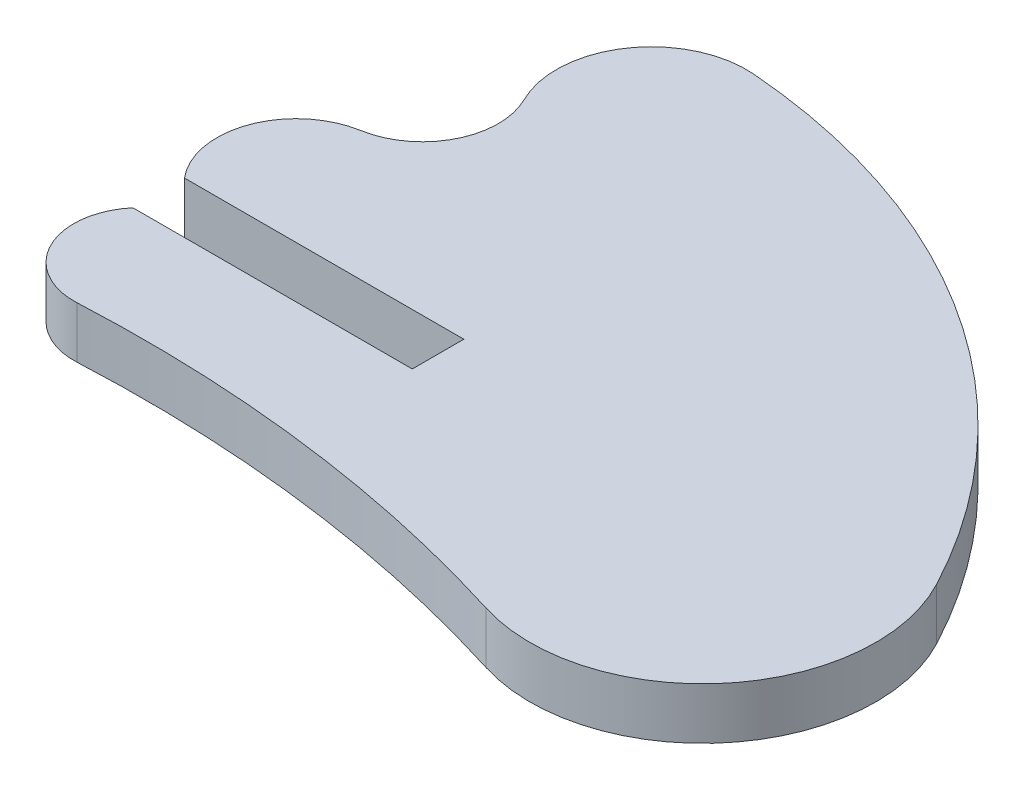
ISO-10303-21;
HEADER;
FILE_DESCRIPTION(('STEP AP214'),'2;1');
FILE_NAME('part.step','',(''),(''),'','','');
FILE_SCHEMA(('AUTOMOTIVE_DESIGN { 1 0 10303 214 1 1 1 1 }'));
ENDSEC;
DATA;
#1=APPLICATION_CONTEXT('core data for automotive mechanical design processes');
#2=APPLICATION_PROTOCOL_DEFINITION('international standard','automotive_design',2000,#1);
#3=PRODUCT_CONTEXT('',#1,'mechanical');
#4=PRODUCT('Part','Part','',(#3));
#5=PRODUCT_RELATED_PRODUCT_CATEGORY('part','',(#4));
#6=PRODUCT_DEFINITION_FORMATION('','',#4);
#7=PRODUCT_DEFINITION_CONTEXT('part definition',#1,'design');
#8=PRODUCT_DEFINITION('design','',#6,#7);
#9=PRODUCT_DEFINITION_SHAPE('','',#8);
#10=(LENGTH_UNIT() NAMED_UNIT(*) SI_UNIT(.MILLI.,.METRE.));
#11=(NAMED_UNIT(*) PLANE_ANGLE_UNIT() SI_UNIT($,.RADIAN.));
#12=(NAMED_UNIT(*) SI_UNIT($,.STERADIAN.) SOLID_ANGLE_UNIT());
#13=UNCERTAINTY_MEASURE_WITH_UNIT(LENGTH_MEASURE(1.E-05),#10,'distance_accuracy_value','');
#14=(GEOMETRIC_REPRESENTATION_CONTEXT(3) GLOBAL_UNCERTAINTY_ASSIGNED_CONTEXT((#13)) GLOBAL_UNIT_ASSIGNED_CONTEXT((#10,
#11,#12)) REPRESENTATION_CONTEXT('',''));
#15=CARTESIAN_POINT('',(0.,0.,0.));
#16=DIRECTION('',(0.,0.,1.));
#17=DIRECTION('',(1.,0.,0.));
#18=AXIS2_PLACEMENT_3D('',#15,#16,#17);
#19=CARTESIAN_POINT('',(-41817.0317918192,3.,-18208.9563791856));
#20=DIRECTION('',(0.,-1.,0.));
#21=DIRECTION('',(0.,0.,-1.));
#22=AXIS2_PLACEMENT_3D('',#19,#20,#21);
#23=CYLINDRICAL_SURFACE('',#22,10.0652598486996);
#24=CARTESIAN_POINT('',(-41817.0317918192,0.,-18208.9563791856));
#25=DIRECTION('',(0.,1.,0.));
#26=DIRECTION('',(0.,0.,1.));
#27=AXIS2_PLACEMENT_3D('',#24,#25,#26);
#28=CIRCLE('',#27,10.0652598486996);
#29=CARTESIAN_POINT('',(-41820.040166,0.,-18199.3512170001));
#30=VERTEX_POINT('',#29);
#31=CARTESIAN_POINT('',(-41808.137642,0.,-18213.668444));
#32=VERTEX_POINT('',#31);
#33=EDGE_CURVE('E143',#30,#32,#28,.T.);
#34=ORIENTED_EDGE('',*,*,#33,.T.);
#35=DIRECTION('',(0.,-1.,0.));
#36=VECTOR('',#35,1.);
#37=CARTESIAN_POINT('',(-41808.137642,3.,-18213.668444));
#38=LINE('',#37,#36);
#39=CARTESIAN_POINT('',(-41808.137642,3.,-18213.668444));
#40=VERTEX_POINT('',#39);
#41=EDGE_CURVE('E11',#40,#32,#38,.T.);
#42=ORIENTED_EDGE('',*,*,#41,.F.);
#43=CARTESIAN_POINT('',(-41817.0317918192,3.,-18208.9563791856));
#44=DIRECTION('',(0.,1.,0.));
#45=DIRECTION('',(0.,0.,1.));
#46=AXIS2_PLACEMENT_3D('',#43,#44,#45);
#47=CIRCLE('',#46,10.0652598486996);
#48=CARTESIAN_POINT('',(-41820.040166,3.,-18199.3512170001));
#49=VERTEX_POINT('',#48);
#50=EDGE_CURVE('E161',#49,#40,#47,.T.);
#51=ORIENTED_EDGE('',*,*,#50,.F.);
#52=DIRECTION('',(0.,-1.,0.));
#53=VECTOR('',#52,1.);
#54=CARTESIAN_POINT('',(-41820.040166,3.,-18199.3512170001));
#55=LINE('',#54,#53);
#56=EDGE_CURVE('E139',#49,#30,#55,.T.);
#57=ORIENTED_EDGE('',*,*,#56,.T.);
#58=EDGE_LOOP('',(#34,#42,#51,#57));
#59=FACE_BOUND('',#58,.T.);
#60=ADVANCED_FACE('F35',(#59),#23,.T.);
#61=CARTESIAN_POINT('',(-41842.1884395668,3.,-18195.6353827592));
#62=DIRECTION('',(0.,-1.,0.));
#63=DIRECTION('',(0.,0.,-1.));
#64=AXIS2_PLACEMENT_3D('',#61,#62,#63);
#65=CYLINDRICAL_SURFACE('',#64,38.5311317332988);
#66=CARTESIAN_POINT('',(-41842.1884395668,0.,-18195.6353827592));
#67=DIRECTION('',(0.,1.,0.));
#68=DIRECTION('',(0.,0.,1.));
#69=AXIS2_PLACEMENT_3D('',#66,#67,#68);
#70=CIRCLE('',#69,38.5311317332988);
#71=CARTESIAN_POINT('',(-41839.185761,0.,-18234.0493390001));
#72=VERTEX_POINT('',#71);
#73=EDGE_CURVE('E146',#32,#72,#70,.T.);
#74=ORIENTED_EDGE('',*,*,#73,.T.);
#75=DIRECTION('',(0.,-1.,0.));
#76=VECTOR('',#75,1.);
#77=CARTESIAN_POINT('',(-41839.185761,3.,-18234.0493390001));
#78=LINE('',#77,#76);
#79=CARTESIAN_POINT('',(-41839.185761,3.,-18234.0493390001));
#80=VERTEX_POINT('',#79);
#81=EDGE_CURVE('E43',#80,#72,#78,.T.);
#82=ORIENTED_EDGE('',*,*,#81,.F.);
#83=CARTESIAN_POINT('',(-41842.1884395668,3.,-18195.6353827592));
#84=DIRECTION('',(0.,1.,0.));
#85=DIRECTION('',(0.,0.,1.));
#86=AXIS2_PLACEMENT_3D('',#83,#84,#85);
#87=CIRCLE('',#86,38.5311317332988);
#88=EDGE_CURVE('E100',#40,#80,#87,.T.);
#89=ORIENTED_EDGE('',*,*,#88,.F.);
#90=ORIENTED_EDGE('',*,*,#41,.T.);
#91=EDGE_LOOP('',(#74,#82,#89,#90));
#92=FACE_BOUND('',#91,.T.);
#93=ADVANCED_FACE('F210',(#92),#65,.T.);
#94=CARTESIAN_POINT('',(-41839.6167840551,3.,-18228.5455191944));
#95=DIRECTION('',(0.,-1.,0.));
#96=DIRECTION('',(0.,0.,-1.));
#97=AXIS2_PLACEMENT_3D('',#94,#95,#96);
#98=CYLINDRICAL_SURFACE('',#97,5.52067145621627);
#99=CARTESIAN_POINT('',(-41839.6167840551,0.,-18228.5455191944));
#100=DIRECTION('',(0.,1.,0.));
#101=DIRECTION('',(0.,0.,1.));
#102=AXIS2_PLACEMENT_3D('',#99,#100,#101);
#103=CIRCLE('',#102,5.52067145621627);
#104=CARTESIAN_POINT('',(-41844.559122,0.,-18226.085619));
#105=VERTEX_POINT('',#104);
#106=EDGE_CURVE('E148',#72,#105,#103,.T.);
#107=ORIENTED_EDGE('',*,*,#106,.T.);
#108=DIRECTION('',(0.,-1.,0.));
#109=VECTOR('',#108,1.);
#110=CARTESIAN_POINT('',(-41844.559122,3.,-18226.085619));
#111=LINE('',#110,#109);
#112=CARTESIAN_POINT('',(-41844.559122,3.,-18226.085619));
#113=VERTEX_POINT('',#112);
#114=EDGE_CURVE('E174',#113,#105,#111,.T.);
#115=ORIENTED_EDGE('',*,*,#114,.F.);
#116=CARTESIAN_POINT('',(-41839.6167840551,3.,-18228.5455191944));
#117=DIRECTION('',(0.,1.,0.));
#118=DIRECTION('',(0.,0.,1.));
#119=AXIS2_PLACEMENT_3D('',#116,#117,#118);
#120=CIRCLE('',#119,5.52067145621627);
#121=EDGE_CURVE('E182',#80,#113,#120,.T.);
#122=ORIENTED_EDGE('',*,*,#121,.F.);
#123=ORIENTED_EDGE('',*,*,#81,.T.);
#124=EDGE_LOOP('',(#107,#115,#122,#123));
#125=FACE_BOUND('',#124,.T.);
#126=ADVANCED_FACE('F180',(#125),#98,.T.);
#127=CARTESIAN_POINT('',(-41848.5079255053,3.,-18224.1189168166));
#128=DIRECTION('',(0.,-1.,0.));
#129=DIRECTION('',(0.,0.,-1.));
#130=AXIS2_PLACEMENT_3D('',#127,#128,#129);
#131=CYLINDRICAL_SURFACE('',#130,4.41145855720187);
#132=CARTESIAN_POINT('',(-41848.5079255053,0.,-18224.1189168166));
#133=DIRECTION('',(0.,-1.,0.));
#134=DIRECTION('',(0.,0.,1.));
#135=AXIS2_PLACEMENT_3D('',#132,#133,#134);
#136=CIRCLE('',#135,4.41145855720187);
#137=CARTESIAN_POINT('',(-41847.755704,0.,-18219.772064));
#138=VERTEX_POINT('',#137);
#139=EDGE_CURVE('E150',#105,#138,#136,.T.);
#140=ORIENTED_EDGE('',*,*,#139,.T.);
#141=DIRECTION('',(0.,-1.,0.));
#142=VECTOR('',#141,1.);
#143=CARTESIAN_POINT('',(-41847.755704,3.,-18219.772064));
#144=LINE('',#143,#142);
#145=CARTESIAN_POINT('',(-41847.755704,3.,-18219.772064));
#146=VERTEX_POINT('',#145);
#147=EDGE_CURVE('E171',#146,#138,#144,.T.);
#148=ORIENTED_EDGE('',*,*,#147,.F.);
#149=CARTESIAN_POINT('',(-41848.5079255053,3.,-18224.1189168166));
#150=DIRECTION('',(0.,-1.,0.));
#151=DIRECTION('',(0.,0.,1.));
#152=AXIS2_PLACEMENT_3D('',#149,#150,#151);
#153=CIRCLE('',#152,4.41145855720187);
#154=EDGE_CURVE('E200',#113,#146,#153,.T.);
#155=ORIENTED_EDGE('',*,*,#154,.F.);
#156=ORIENTED_EDGE('',*,*,#114,.T.);
#157=EDGE_LOOP('',(#140,#148,#155,#156));
#158=FACE_BOUND('',#157,.T.);
#159=ADVANCED_FACE('F191',(#158),#131,.F.);
#160=CARTESIAN_POINT('',(-41846.9736069678,3.,-18215.2298035558));
#161=DIRECTION('',(0.,-1.,0.));
#162=DIRECTION('',(0.,0.,-1.));
#163=AXIS2_PLACEMENT_3D('',#160,#161,#162);
#164=CYLINDRICAL_SURFACE('',#163,4.60910031469796);
#165=CARTESIAN_POINT('',(-41846.9736069678,0.,-18215.2298035558));
#166=DIRECTION('',(0.,1.,0.));
#167=DIRECTION('',(0.,0.,1.));
#168=AXIS2_PLACEMENT_3D('',#165,#166,#167);
#169=CIRCLE('',#168,4.60910031469796);
#170=CARTESIAN_POINT('',(-41850.488281,0.,-18212.248047));
#171=VERTEX_POINT('',#170);
#172=EDGE_CURVE('E152',#138,#171,#169,.T.);
#173=ORIENTED_EDGE('',*,*,#172,.T.);
#174=DIRECTION('',(0.,-1.,0.));
#175=VECTOR('',#174,1.);
#176=CARTESIAN_POINT('',(-41850.488281,3.,-18212.248047));
#177=LINE('',#176,#175);
#178=CARTESIAN_POINT('',(-41850.488281,3.,-18212.248047));
#179=VERTEX_POINT('',#178);
#180=EDGE_CURVE('E168',#179,#171,#177,.T.);
#181=ORIENTED_EDGE('',*,*,#180,.F.);
#182=CARTESIAN_POINT('',(-41846.9736069678,3.,-18215.2298035558));
#183=DIRECTION('',(0.,1.,0.));
#184=DIRECTION('',(0.,0.,1.));
#185=AXIS2_PLACEMENT_3D('',#182,#183,#184);
#186=CIRCLE('',#185,4.60910031469796);
#187=EDGE_CURVE('E197',#146,#179,#186,.T.);
#188=ORIENTED_EDGE('',*,*,#187,.F.);
#189=ORIENTED_EDGE('',*,*,#147,.T.);
#190=EDGE_LOOP('',(#173,#181,#188,#189));
#191=FACE_BOUND('',#190,.T.);
#192=ADVANCED_FACE('F195',(#191),#164,.T.);
#193=CARTESIAN_POINT('',(-41834.238281,3.,-18212.251953));
#194=DIRECTION('',(-0.00024036922556715,0.,-0.999999971111317));
#195=DIRECTION('',(-0.999999971111317,0.,0.00024036922556715));
#196=AXIS2_PLACEMENT_3D('',#193,#194,#195);
#197=PLANE('',#196);
#198=DIRECTION('',(0.999999971111317,0.,-0.000240369225567149));
#199=VECTOR('',#198,1.);
#200=CARTESIAN_POINT('',(-41834.238281,0.,-18212.251953));
#201=LINE('',#200,#199);
#202=CARTESIAN_POINT('',(-41834.238281,0.,-18212.251953));
#203=VERTEX_POINT('',#202);
#204=EDGE_CURVE('E154',#171,#203,#201,.T.);
#205=ORIENTED_EDGE('',*,*,#204,.T.);
#206=DIRECTION('',(0.,-1.,0.));
#207=VECTOR('',#206,1.);
#208=CARTESIAN_POINT('',(-41834.238281,3.,-18212.251953));
#209=LINE('',#208,#207);
#210=CARTESIAN_POINT('',(-41834.238281,3.,-18212.251953));
#211=VERTEX_POINT('',#210);
#212=EDGE_CURVE('E165',#211,#203,#209,.T.);
#213=ORIENTED_EDGE('',*,*,#212,.F.);
#214=DIRECTION('',(0.999999971111317,0.,-0.000240369225567149));
#215=VECTOR('',#214,1.);
#216=CARTESIAN_POINT('',(-41834.238281,3.,-18212.251953));
#217=LINE('',#216,#215);
#218=EDGE_CURVE('E199',#179,#211,#217,.T.);
#219=ORIENTED_EDGE('',*,*,#218,.F.);
#220=ORIENTED_EDGE('',*,*,#180,.T.);
#221=EDGE_LOOP('',(#205,#213,#219,#220));
#222=FACE_BOUND('',#221,.T.);
#223=ADVANCED_FACE('F222',(#222),#197,.F.);
#224=CARTESIAN_POINT('',(-41834.238281,3.,-18209.253906));
#225=DIRECTION('',(1.,0.,0.));
#226=DIRECTION('',(0.,0.,-1.));
#227=AXIS2_PLACEMENT_3D('',#224,#225,#226);
#228=PLANE('',#227);
#229=DIRECTION('',(0.,0.,1.));
#230=VECTOR('',#229,1.);
#231=CARTESIAN_POINT('',(-41834.238281,0.,-18209.253906));
#232=LINE('',#231,#230);
#233=CARTESIAN_POINT('',(-41834.238281,0.,-18209.253906));
#234=VERTEX_POINT('',#233);
#235=EDGE_CURVE('E156',#203,#234,#232,.T.);
#236=ORIENTED_EDGE('',*,*,#235,.T.);
#237=DIRECTION('',(0.,-1.,0.));
#238=VECTOR('',#237,1.);
#239=CARTESIAN_POINT('',(-41834.238281,3.,-18209.253906));
#240=LINE('',#239,#238);
#241=CARTESIAN_POINT('',(-41834.238281,3.,-18209.253906));
#242=VERTEX_POINT('',#241);
#243=EDGE_CURVE('E134',#242,#234,#240,.T.);
#244=ORIENTED_EDGE('',*,*,#243,.F.);
#245=DIRECTION('',(0.,0.,1.));
#246=VECTOR('',#245,1.);
#247=CARTESIAN_POINT('',(-41834.238281,3.,-18209.253906));
#248=LINE('',#247,#246);
#249=EDGE_CURVE('E125',#211,#242,#248,.T.);
#250=ORIENTED_EDGE('',*,*,#249,.F.);
#251=ORIENTED_EDGE('',*,*,#212,.T.);
#252=EDGE_LOOP('',(#236,#244,#250,#251));
#253=FACE_BOUND('',#252,.T.);
#254=ADVANCED_FACE('F225',(#253),#228,.F.);
#255=CARTESIAN_POINT('',(-41850.486809,3.,-18209.248787));
#256=DIRECTION('',(0.000315043904318093,0.,0.999999950373668));
#257=DIRECTION('',(0.999999950373668,0.,-0.000315043904318094));
#258=AXIS2_PLACEMENT_3D('',#255,#256,#257);
#259=PLANE('',#258);
#260=DIRECTION('',(-0.999999950373668,0.,0.000315043904318094));
#261=VECTOR('',#260,1.);
#262=CARTESIAN_POINT('',(-41850.486809,0.,-18209.248787));
#263=LINE('',#262,#261);
#264=CARTESIAN_POINT('',(-41850.486809,0.,-18209.248787));
#265=VERTEX_POINT('',#264);
#266=EDGE_CURVE('E133',#234,#265,#263,.T.);
#267=ORIENTED_EDGE('',*,*,#266,.T.);
#268=DIRECTION('',(0.,-1.,0.));
#269=VECTOR('',#268,1.);
#270=CARTESIAN_POINT('',(-41850.486809,3.,-18209.248787));
#271=LINE('',#270,#269);
#272=CARTESIAN_POINT('',(-41850.486809,3.,-18209.248787));
#273=VERTEX_POINT('',#272);
#274=EDGE_CURVE('E130',#273,#265,#271,.T.);
#275=ORIENTED_EDGE('',*,*,#274,.F.);
#276=DIRECTION('',(-0.999999950373668,0.,0.000315043904318094));
#277=VECTOR('',#276,1.);
#278=CARTESIAN_POINT('',(-41850.486809,3.,-18209.248787));
#279=LINE('',#278,#277);
#280=EDGE_CURVE('E119',#242,#273,#279,.T.);
#281=ORIENTED_EDGE('',*,*,#280,.F.);
#282=ORIENTED_EDGE('',*,*,#243,.T.);
#283=EDGE_LOOP('',(#267,#275,#281,#282));
#284=FACE_BOUND('',#283,.T.);
#285=ADVANCED_FACE('F131',(#284),#259,.F.);
#286=CARTESIAN_POINT('',(-41847.5194658819,3.,-18206.7264299033));
#287=DIRECTION('',(0.,-1.,0.));
#288=DIRECTION('',(0.,0.,-1.));
#289=AXIS2_PLACEMENT_3D('',#286,#287,#288);
#290=CYLINDRICAL_SURFACE('',#289,3.89453598055927);
#291=CARTESIAN_POINT('',(-41847.5194658819,0.,-18206.7264299033));
#292=DIRECTION('',(0.,1.,0.));
#293=DIRECTION('',(0.,0.,1.));
#294=AXIS2_PLACEMENT_3D('',#291,#292,#293);
#295=CIRCLE('',#294,3.89453598055927);
#296=CARTESIAN_POINT('',(-41847.325924,0.,-18202.8367060001));
#297=VERTEX_POINT('',#296);
#298=EDGE_CURVE('E86',#265,#297,#295,.T.);
#299=ORIENTED_EDGE('',*,*,#298,.T.);
#300=DIRECTION('',(0.,-1.,0.));
#301=VECTOR('',#300,1.);
#302=CARTESIAN_POINT('',(-41847.325924,3.,-18202.8367060001));
#303=LINE('',#302,#301);
#304=CARTESIAN_POINT('',(-41847.325924,3.,-18202.8367060001));
#305=VERTEX_POINT('',#304);
#306=EDGE_CURVE('E135',#305,#297,#303,.T.);
#307=ORIENTED_EDGE('',*,*,#306,.F.);
#308=CARTESIAN_POINT('',(-41847.5194658819,3.,-18206.7264299033));
#309=DIRECTION('',(0.,1.,0.));
#310=DIRECTION('',(0.,0.,1.));
#311=AXIS2_PLACEMENT_3D('',#308,#309,#310);
#312=CIRCLE('',#311,3.89453598055927);
#313=EDGE_CURVE('E123',#273,#305,#312,.T.);
#314=ORIENTED_EDGE('',*,*,#313,.F.);
#315=ORIENTED_EDGE('',*,*,#274,.T.);
#316=EDGE_LOOP('',(#299,#307,#314,#315));
#317=FACE_BOUND('',#316,.T.);
#318=ADVANCED_FACE('F137',(#317),#290,.T.);
#319=CARTESIAN_POINT('',(-41843.460937936,3.,-18124.5488281196));
#320=DIRECTION('',(0.,-1.,0.));
#321=DIRECTION('',(0.,0.,-1.));
#322=AXIS2_PLACEMENT_3D('',#319,#320,#321);
#323=CYLINDRICAL_SURFACE('',#322,78.3832248654022);
#324=CARTESIAN_POINT('',(-41843.460937936,0.,-18124.5488281196));
#325=DIRECTION('',(0.,-1.,0.));
#326=DIRECTION('',(0.,0.,1.));
#327=AXIS2_PLACEMENT_3D('',#324,#325,#326);
#328=CIRCLE('',#327,78.3832248654022);
#329=EDGE_CURVE('E92',#297,#30,#328,.T.);
#330=ORIENTED_EDGE('',*,*,#329,.T.);
#331=ORIENTED_EDGE('',*,*,#56,.F.);
#332=CARTESIAN_POINT('',(-41843.460937936,3.,-18124.5488281196));
#333=DIRECTION('',(0.,-1.,0.));
#334=DIRECTION('',(0.,0.,1.));
#335=AXIS2_PLACEMENT_3D('',#332,#333,#334);
#336=CIRCLE('',#335,78.3832248654022);
#337=EDGE_CURVE('E51',#305,#49,#336,.T.);
#338=ORIENTED_EDGE('',*,*,#337,.F.);
#339=ORIENTED_EDGE('',*,*,#306,.T.);
#340=EDGE_LOOP('',(#330,#331,#338,#339));
#341=FACE_BOUND('',#340,.T.);
#342=ADVANCED_FACE('F234',(#341),#323,.F.);
#343=CARTESIAN_POINT('',(-41817.0317918192,3.,-18208.9563791856));
#344=DIRECTION('',(0.,1.,0.));
#345=DIRECTION('',(0.,0.,1.));
#346=AXIS2_PLACEMENT_3D('',#343,#344,#345);
#347=PLANE('',#346);
#348=ORIENTED_EDGE('',*,*,#50,.T.);
#349=ORIENTED_EDGE('',*,*,#88,.T.);
#350=ORIENTED_EDGE('',*,*,#121,.T.);
#351=ORIENTED_EDGE('',*,*,#154,.T.);
#352=ORIENTED_EDGE('',*,*,#187,.T.);
#353=ORIENTED_EDGE('',*,*,#218,.T.);
#354=ORIENTED_EDGE('',*,*,#249,.T.);
#355=ORIENTED_EDGE('',*,*,#280,.T.);
#356=ORIENTED_EDGE('',*,*,#313,.T.);
#357=ORIENTED_EDGE('',*,*,#337,.T.);
#358=EDGE_LOOP('',(#348,#349,#350,#351,#352,#353,#354,#355,#356,#357));
#359=FACE_BOUND('',#358,.T.);
#360=ADVANCED_FACE('F121',(#359),#347,.T.);
#361=CARTESIAN_POINT('',(-41817.0317918192,0.,-18208.9563791856));
#362=DIRECTION('',(0.,1.,0.));
#363=DIRECTION('',(0.,0.,1.));
#364=AXIS2_PLACEMENT_3D('',#361,#362,#363);
#365=PLANE('',#364);
#366=ORIENTED_EDGE('',*,*,#33,.F.);
#367=ORIENTED_EDGE('',*,*,#329,.F.);
#368=ORIENTED_EDGE('',*,*,#298,.F.);
#369=ORIENTED_EDGE('',*,*,#266,.F.);
#370=ORIENTED_EDGE('',*,*,#235,.F.);
#371=ORIENTED_EDGE('',*,*,#204,.F.);
#372=ORIENTED_EDGE('',*,*,#172,.F.);
#373=ORIENTED_EDGE('',*,*,#139,.F.);
#374=ORIENTED_EDGE('',*,*,#106,.F.);
#375=ORIENTED_EDGE('',*,*,#73,.F.);
#376=EDGE_LOOP('',(#366,#367,#368,#369,#370,#371,#372,#373,#374,#375));
#377=FACE_BOUND('',#376,.T.);
#378=ADVANCED_FACE('F186',(#377),#365,.F.);
#379=CLOSED_SHELL('',(#60,#93,#126,#159,#192,#223,#254,#285,#318,#342,#360,#378));
#380=MANIFOLD_SOLID_BREP('B2',#379);
#381=ADVANCED_BREP_SHAPE_REPRESENTATION('',(#18,#380),#14);
#382=SHAPE_DEFINITION_REPRESENTATION(#9,#381);
ENDSEC;
END-ISO-10303-21;
